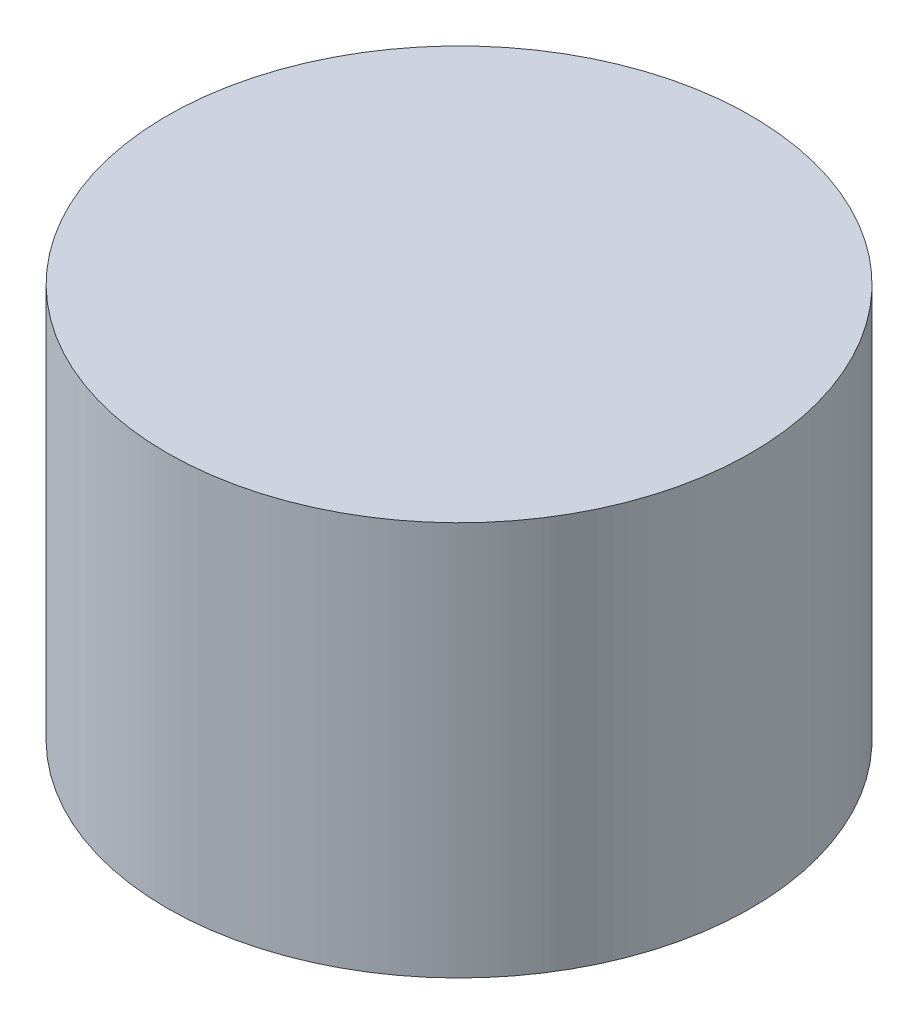
ISO-10303-21;
HEADER;
FILE_DESCRIPTION(('STEP AP214'),'2;1');
FILE_NAME('part.step','',(''),(''),'','','');
FILE_SCHEMA(('AUTOMOTIVE_DESIGN { 1 0 10303 214 1 1 1 1 }'));
ENDSEC;
DATA;
#1=APPLICATION_CONTEXT('core data for automotive mechanical design processes');
#2=APPLICATION_PROTOCOL_DEFINITION('international standard','automotive_design',2000,#1);
#3=PRODUCT_CONTEXT('',#1,'mechanical');
#4=PRODUCT('Part','Part','',(#3));
#5=PRODUCT_RELATED_PRODUCT_CATEGORY('part','',(#4));
#6=PRODUCT_DEFINITION_FORMATION('','',#4);
#7=PRODUCT_DEFINITION_CONTEXT('part definition',#1,'design');
#8=PRODUCT_DEFINITION('design','',#6,#7);
#9=PRODUCT_DEFINITION_SHAPE('','',#8);
#10=(LENGTH_UNIT() NAMED_UNIT(*) SI_UNIT(.MILLI.,.METRE.));
#11=(NAMED_UNIT(*) PLANE_ANGLE_UNIT() SI_UNIT($,.RADIAN.));
#12=(NAMED_UNIT(*) SI_UNIT($,.STERADIAN.) SOLID_ANGLE_UNIT());
#13=UNCERTAINTY_MEASURE_WITH_UNIT(LENGTH_MEASURE(1.E-05),#10,'distance_accuracy_value','');
#14=(GEOMETRIC_REPRESENTATION_CONTEXT(3) GLOBAL_UNCERTAINTY_ASSIGNED_CONTEXT((#13)) GLOBAL_UNIT_ASSIGNED_CONTEXT((#10,
#11,#12)) REPRESENTATION_CONTEXT('',''));
#15=CARTESIAN_POINT('',(0.,0.,0.));
#16=DIRECTION('',(0.,0.,1.));
#17=DIRECTION('',(1.,0.,0.));
#18=AXIS2_PLACEMENT_3D('',#15,#16,#17);
#19=CARTESIAN_POINT('',(0.,27.,0.));
#20=DIRECTION('',(0.,-1.,0.));
#21=DIRECTION('',(0.,0.,-1.));
#22=AXIS2_PLACEMENT_3D('',#19,#20,#21);
#23=CYLINDRICAL_SURFACE('',#22,20.);
#24=CARTESIAN_POINT('',(0.,27.,0.));
#25=DIRECTION('',(0.,1.,0.));
#26=DIRECTION('',(0.,0.,1.));
#27=AXIS2_PLACEMENT_3D('',#24,#25,#26);
#28=CIRCLE('',#27,20.);
#29=CARTESIAN_POINT('',(0.,27.,20.));
#30=VERTEX_POINT('',#29);
#31=EDGE_CURVE('E10',#30,#30,#28,.T.);
#32=ORIENTED_EDGE('',*,*,#31,.F.);
#33=EDGE_LOOP('',(#32));
#34=FACE_BOUND('',#33,.T.);
#35=CARTESIAN_POINT('',(0.,0.,0.));
#36=DIRECTION('',(0.,1.,0.));
#37=DIRECTION('',(0.,0.,1.));
#38=AXIS2_PLACEMENT_3D('',#35,#36,#37);
#39=CIRCLE('',#38,20.);
#40=CARTESIAN_POINT('',(0.,0.,20.));
#41=VERTEX_POINT('',#40);
#42=EDGE_CURVE('E37',#41,#41,#39,.T.);
#43=ORIENTED_EDGE('',*,*,#42,.T.);
#44=EDGE_LOOP('',(#43));
#45=FACE_BOUND('',#44,.T.);
#46=ADVANCED_FACE('F34',(#34,#45),#23,.T.);
#47=CARTESIAN_POINT('',(0.,27.,0.));
#48=DIRECTION('',(0.,1.,0.));
#49=DIRECTION('',(0.,0.,1.));
#50=AXIS2_PLACEMENT_3D('',#47,#48,#49);
#51=PLANE('',#50);
#52=ORIENTED_EDGE('',*,*,#31,.T.);
#53=EDGE_LOOP('',(#52));
#54=FACE_BOUND('',#53,.T.);
#55=ADVANCED_FACE('F77',(#54),#51,.T.);
#56=CARTESIAN_POINT('',(0.,0.,0.));
#57=DIRECTION('',(0.,1.,0.));
#58=DIRECTION('',(0.,0.,1.));
#59=AXIS2_PLACEMENT_3D('',#56,#57,#58);
#60=PLANE('',#59);
#61=CARTESIAN_POINT('',(11.2583302491985,0.,-6.49999999999952));
#62=DIRECTION('',(0.,-1.,0.));
#63=DIRECTION('',(0.,0.,-1.));
#64=AXIS2_PLACEMENT_3D('',#61,#62,#63);
#65=CIRCLE('',#64,1.50000000000072);
#66=CARTESIAN_POINT('',(11.2583302491985,0.,-8.00000000000023));
#67=VERTEX_POINT('',#66);
#68=EDGE_CURVE('E58',#67,#67,#65,.T.);
#69=ORIENTED_EDGE('',*,*,#68,.F.);
#70=EDGE_LOOP('',(#69));
#71=FACE_BOUND('',#70,.T.);
#72=CARTESIAN_POINT('',(-11.2583302491969,0.,-6.50000000000048));
#73=DIRECTION('',(0.,-1.,0.));
#74=DIRECTION('',(0.,0.,-1.));
#75=AXIS2_PLACEMENT_3D('',#72,#73,#74);
#76=CIRCLE('',#75,1.50000000000105);
#77=CARTESIAN_POINT('',(-11.2583302491969,0.,-8.00000000000153));
#78=VERTEX_POINT('',#77);
#79=EDGE_CURVE('E52',#78,#78,#76,.T.);
#80=ORIENTED_EDGE('',*,*,#79,.F.);
#81=EDGE_LOOP('',(#80));
#82=FACE_BOUND('',#81,.T.);
#83=CARTESIAN_POINT('',(0.,0.,13.));
#84=DIRECTION('',(0.,-1.,0.));
#85=DIRECTION('',(0.,0.,-1.));
#86=AXIS2_PLACEMENT_3D('',#83,#84,#85);
#87=CIRCLE('',#86,1.5);
#88=CARTESIAN_POINT('',(0.,0.,11.5));
#89=VERTEX_POINT('',#88);
#90=EDGE_CURVE('E46',#89,#89,#87,.T.);
#91=ORIENTED_EDGE('',*,*,#90,.F.);
#92=EDGE_LOOP('',(#91));
#93=FACE_BOUND('',#92,.T.);
#94=ORIENTED_EDGE('',*,*,#42,.F.);
#95=EDGE_LOOP('',(#94));
#96=FACE_BOUND('',#95,.T.);
#97=ADVANCED_FACE('F73',(#71,#82,#93,#96),#60,.F.);
#98=CARTESIAN_POINT('',(0.,6.,13.));
#99=DIRECTION('',(0.,-1.,0.));
#100=DIRECTION('',(0.,0.,-1.));
#101=AXIS2_PLACEMENT_3D('',#98,#99,#100);
#102=CYLINDRICAL_SURFACE('',#101,1.5);
#103=CARTESIAN_POINT('',(0.,6.,13.));
#104=DIRECTION('',(0.,-1.,0.));
#105=DIRECTION('',(0.,0.,-1.));
#106=AXIS2_PLACEMENT_3D('',#103,#104,#105);
#107=CIRCLE('',#106,1.5);
#108=CARTESIAN_POINT('',(0.,6.,11.5));
#109=VERTEX_POINT('',#108);
#110=EDGE_CURVE('E44',#109,#109,#107,.T.);
#111=ORIENTED_EDGE('',*,*,#110,.F.);
#112=EDGE_LOOP('',(#111));
#113=FACE_BOUND('',#112,.T.);
#114=ORIENTED_EDGE('',*,*,#90,.T.);
#115=EDGE_LOOP('',(#114));
#116=FACE_BOUND('',#115,.T.);
#117=ADVANCED_FACE('F76',(#113,#116),#102,.F.);
#118=CARTESIAN_POINT('',(0.,6.,13.));
#119=DIRECTION('',(0.,-1.,0.));
#120=DIRECTION('',(0.,0.,-1.));
#121=AXIS2_PLACEMENT_3D('',#118,#119,#120);
#122=PLANE('',#121);
#123=ORIENTED_EDGE('',*,*,#110,.T.);
#124=EDGE_LOOP('',(#123));
#125=FACE_BOUND('',#124,.T.);
#126=ADVANCED_FACE('F95',(#125),#122,.T.);
#127=CARTESIAN_POINT('',(-11.2583302491969,6.,-6.50000000000048));
#128=DIRECTION('',(0.,-1.,0.));
#129=DIRECTION('',(0.,0.,-1.));
#130=AXIS2_PLACEMENT_3D('',#127,#128,#129);
#131=CYLINDRICAL_SURFACE('',#130,1.50000000000105);
#132=CARTESIAN_POINT('',(-11.2583302491969,6.,-6.50000000000048));
#133=DIRECTION('',(0.,-1.,0.));
#134=DIRECTION('',(0.,0.,-1.));
#135=AXIS2_PLACEMENT_3D('',#132,#133,#134);
#136=CIRCLE('',#135,1.50000000000105);
#137=CARTESIAN_POINT('',(-11.2583302491969,6.,-8.00000000000153));
#138=VERTEX_POINT('',#137);
#139=EDGE_CURVE('E55',#138,#138,#136,.T.);
#140=ORIENTED_EDGE('',*,*,#139,.F.);
#141=EDGE_LOOP('',(#140));
#142=FACE_BOUND('',#141,.T.);
#143=ORIENTED_EDGE('',*,*,#79,.T.);
#144=EDGE_LOOP('',(#143));
#145=FACE_BOUND('',#144,.T.);
#146=ADVANCED_FACE('F99',(#142,#145),#131,.F.);
#147=CARTESIAN_POINT('',(-11.2583302491969,6.,-6.50000000000048));
#148=DIRECTION('',(0.,-1.,0.));
#149=DIRECTION('',(0.,0.,-1.));
#150=AXIS2_PLACEMENT_3D('',#147,#148,#149);
#151=PLANE('',#150);
#152=ORIENTED_EDGE('',*,*,#139,.T.);
#153=EDGE_LOOP('',(#152));
#154=FACE_BOUND('',#153,.T.);
#155=ADVANCED_FACE('F69',(#154),#151,.T.);
#156=CARTESIAN_POINT('',(11.2583302491985,6.,-6.49999999999952));
#157=DIRECTION('',(0.,-1.,0.));
#158=DIRECTION('',(0.,0.,-1.));
#159=AXIS2_PLACEMENT_3D('',#156,#157,#158);
#160=CYLINDRICAL_SURFACE('',#159,1.50000000000072);
#161=CARTESIAN_POINT('',(11.2583302491985,6.,-6.49999999999952));
#162=DIRECTION('',(0.,-1.,0.));
#163=DIRECTION('',(0.,0.,-1.));
#164=AXIS2_PLACEMENT_3D('',#161,#162,#163);
#165=CIRCLE('',#164,1.50000000000072);
#166=CARTESIAN_POINT('',(11.2583302491985,6.,-8.00000000000023));
#167=VERTEX_POINT('',#166);
#168=EDGE_CURVE('E49',#167,#167,#165,.T.);
#169=ORIENTED_EDGE('',*,*,#168,.F.);
#170=EDGE_LOOP('',(#169));
#171=FACE_BOUND('',#170,.T.);
#172=ORIENTED_EDGE('',*,*,#68,.T.);
#173=EDGE_LOOP('',(#172));
#174=FACE_BOUND('',#173,.T.);
#175=ADVANCED_FACE('F66',(#171,#174),#160,.F.);
#176=CARTESIAN_POINT('',(11.2583302491985,6.,-6.49999999999952));
#177=DIRECTION('',(0.,-1.,0.));
#178=DIRECTION('',(0.,0.,-1.));
#179=AXIS2_PLACEMENT_3D('',#176,#177,#178);
#180=PLANE('',#179);
#181=ORIENTED_EDGE('',*,*,#168,.T.);
#182=EDGE_LOOP('',(#181));
#183=FACE_BOUND('',#182,.T.);
#184=ADVANCED_FACE('F64',(#183),#180,.T.);
#185=CLOSED_SHELL('',(#46,#55,#97,#117,#126,#146,#155,#175,#184));
#186=MANIFOLD_SOLID_BREP('B2',#185);
#187=ADVANCED_BREP_SHAPE_REPRESENTATION('',(#18,#186),#14);
#188=SHAPE_DEFINITION_REPRESENTATION(#9,#187);
ENDSEC;
END-ISO-10303-21;
